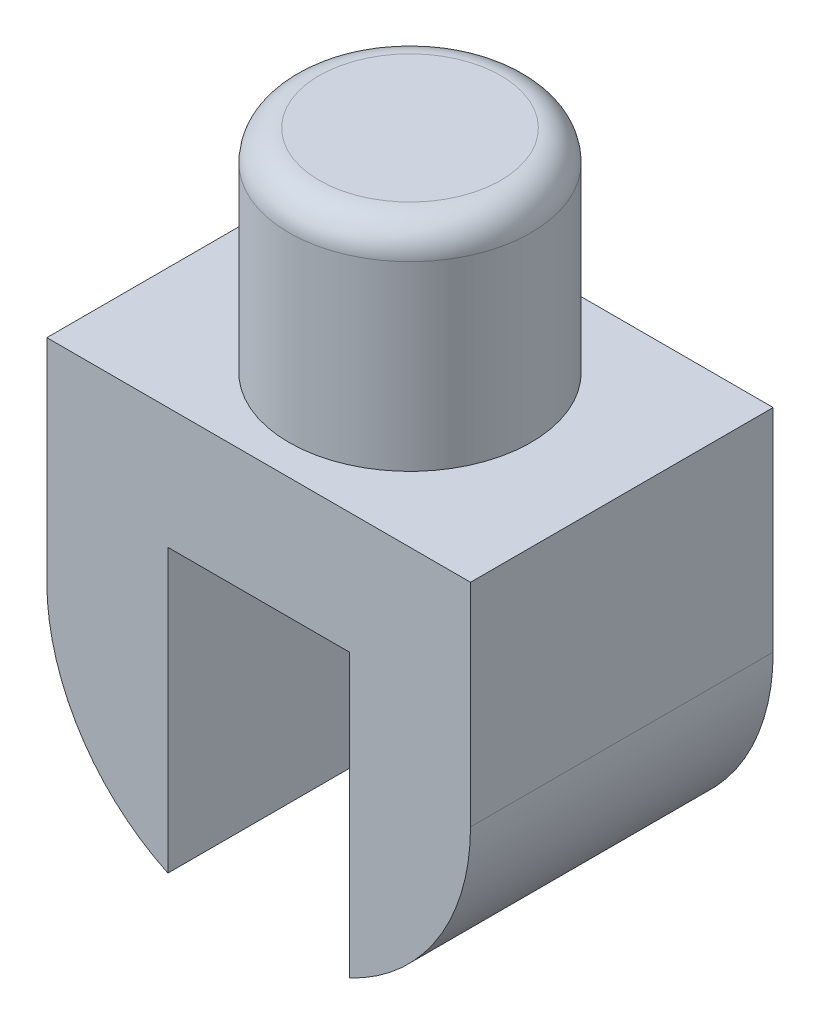
ISO-10303-21;
HEADER;
FILE_DESCRIPTION(('STEP AP214'),'2;1');
FILE_NAME('part.step','',(''),(''),'','','');
FILE_SCHEMA(('AUTOMOTIVE_DESIGN { 1 0 10303 214 1 1 1 1 }'));
ENDSEC;
DATA;
#1=APPLICATION_CONTEXT('core data for automotive mechanical design processes');
#2=APPLICATION_PROTOCOL_DEFINITION('international standard','automotive_design',2000,#1);
#3=PRODUCT_CONTEXT('',#1,'mechanical');
#4=PRODUCT('Part','Part','',(#3));
#5=PRODUCT_RELATED_PRODUCT_CATEGORY('part','',(#4));
#6=PRODUCT_DEFINITION_FORMATION('','',#4);
#7=PRODUCT_DEFINITION_CONTEXT('part definition',#1,'design');
#8=PRODUCT_DEFINITION('design','',#6,#7);
#9=PRODUCT_DEFINITION_SHAPE('','',#8);
#10=(LENGTH_UNIT() NAMED_UNIT(*) SI_UNIT(.MILLI.,.METRE.));
#11=(NAMED_UNIT(*) PLANE_ANGLE_UNIT() SI_UNIT($,.RADIAN.));
#12=(NAMED_UNIT(*) SI_UNIT($,.STERADIAN.) SOLID_ANGLE_UNIT());
#13=UNCERTAINTY_MEASURE_WITH_UNIT(LENGTH_MEASURE(1.E-05),#10,'distance_accuracy_value','');
#14=(GEOMETRIC_REPRESENTATION_CONTEXT(3) GLOBAL_UNCERTAINTY_ASSIGNED_CONTEXT((#13)) GLOBAL_UNIT_ASSIGNED_CONTEXT((#10,
#11,#12)) REPRESENTATION_CONTEXT('',''));
#15=CARTESIAN_POINT('',(0.,0.,0.));
#16=DIRECTION('',(0.,0.,1.));
#17=DIRECTION('',(1.,0.,0.));
#18=AXIS2_PLACEMENT_3D('',#15,#16,#17);
#19=CARTESIAN_POINT('',(0.,-1.94666007386461,-5.));
#20=DIRECTION('',(0.,0.,1.));
#21=DIRECTION('',(1.,0.,0.));
#22=AXIS2_PLACEMENT_3D('',#19,#20,#21);
#23=CYLINDRICAL_SURFACE('',#22,7.);
#24=CARTESIAN_POINT('',(0.,-1.94666007386461,-5.));
#25=DIRECTION('',(0.,0.,1.));
#26=DIRECTION('',(1.,0.,0.));
#27=AXIS2_PLACEMENT_3D('',#24,#25,#26);
#28=CIRCLE('',#27,7.);
#29=CARTESIAN_POINT('',(-7.,-1.94666007386461,-5.));
#30=VERTEX_POINT('',#29);
#31=CARTESIAN_POINT('',(-3.,-8.27121539420137,-5.));
#32=VERTEX_POINT('',#31);
#33=EDGE_CURVE('E143',#30,#32,#28,.T.);
#34=ORIENTED_EDGE('',*,*,#33,.T.);
#35=DIRECTION('',(0.,0.,1.));
#36=VECTOR('',#35,1.);
#37=CARTESIAN_POINT('',(-3.,-8.27121539420137,-5.));
#38=LINE('',#37,#36);
#39=CARTESIAN_POINT('',(-3.,-8.27121539420137,5.));
#40=VERTEX_POINT('',#39);
#41=EDGE_CURVE('E107',#32,#40,#38,.T.);
#42=ORIENTED_EDGE('',*,*,#41,.T.);
#43=CARTESIAN_POINT('',(0.,-1.94666007386461,5.));
#44=DIRECTION('',(0.,0.,1.));
#45=DIRECTION('',(1.,0.,0.));
#46=AXIS2_PLACEMENT_3D('',#43,#44,#45);
#47=CIRCLE('',#46,7.);
#48=CARTESIAN_POINT('',(-7.,-1.94666007386461,5.));
#49=VERTEX_POINT('',#48);
#50=EDGE_CURVE('E129',#49,#40,#47,.T.);
#51=ORIENTED_EDGE('',*,*,#50,.F.);
#52=DIRECTION('',(0.,0.,1.));
#53=VECTOR('',#52,1.);
#54=CARTESIAN_POINT('',(-7.,-1.94666007386461,-5.));
#55=LINE('',#54,#53);
#56=EDGE_CURVE('E58',#30,#49,#55,.T.);
#57=ORIENTED_EDGE('',*,*,#56,.F.);
#58=EDGE_LOOP('',(#34,#42,#51,#57));
#59=FACE_BOUND('',#58,.T.);
#60=ADVANCED_FACE('F35',(#59),#23,.T.);
#61=CARTESIAN_POINT('',(3.,-8.27121539420137,5.));
#62=VERTEX_POINT('',#61);
#63=CARTESIAN_POINT('',(7.,-1.94666007386461,5.));
#64=VERTEX_POINT('',#63);
#65=EDGE_CURVE('E133',#62,#64,#47,.T.);
#66=ORIENTED_EDGE('',*,*,#65,.F.);
#67=DIRECTION('',(0.,0.,1.));
#68=VECTOR('',#67,1.);
#69=CARTESIAN_POINT('',(3.,-8.27121539420137,-5.));
#70=LINE('',#69,#68);
#71=CARTESIAN_POINT('',(3.,-8.27121539420137,-5.));
#72=VERTEX_POINT('',#71);
#73=EDGE_CURVE('E121',#62,#72,#70,.F.);
#74=ORIENTED_EDGE('',*,*,#73,.T.);
#75=CARTESIAN_POINT('',(7.,-1.94666007386461,-5.));
#76=VERTEX_POINT('',#75);
#77=EDGE_CURVE('E142',#72,#76,#28,.T.);
#78=ORIENTED_EDGE('',*,*,#77,.T.);
#79=DIRECTION('',(0.,0.,1.));
#80=VECTOR('',#79,1.);
#81=CARTESIAN_POINT('',(7.,-1.94666007386461,-5.));
#82=LINE('',#81,#80);
#83=EDGE_CURVE('E154',#76,#64,#82,.T.);
#84=ORIENTED_EDGE('',*,*,#83,.T.);
#85=EDGE_LOOP('',(#66,#74,#78,#84));
#86=FACE_BOUND('',#85,.T.);
#87=ADVANCED_FACE('F183',(#86),#23,.T.);
#88=CARTESIAN_POINT('',(0.,-1.94666007386461,-5.));
#89=DIRECTION('',(0.,0.,1.));
#90=DIRECTION('',(1.,0.,0.));
#91=AXIS2_PLACEMENT_3D('',#88,#89,#90);
#92=PLANE('',#91);
#93=DIRECTION('',(0.,1.,0.));
#94=VECTOR('',#93,1.);
#95=CARTESIAN_POINT('',(-3.,-1.94666007386461,-5.));
#96=LINE('',#95,#94);
#97=CARTESIAN_POINT('',(-3.,1.05333992613539,-5.));
#98=VERTEX_POINT('',#97);
#99=EDGE_CURVE('E101',#32,#98,#96,.T.);
#100=ORIENTED_EDGE('',*,*,#99,.F.);
#101=ORIENTED_EDGE('',*,*,#33,.F.);
#102=DIRECTION('',(0.,-1.,0.));
#103=VECTOR('',#102,1.);
#104=CARTESIAN_POINT('',(-7.,-1.94666007386461,-5.));
#105=LINE('',#104,#103);
#106=CARTESIAN_POINT('',(-7.,5.05333992613539,-5.));
#107=VERTEX_POINT('',#106);
#108=EDGE_CURVE('E151',#107,#30,#105,.T.);
#109=ORIENTED_EDGE('',*,*,#108,.F.);
#110=DIRECTION('',(-1.,0.,0.));
#111=VECTOR('',#110,1.);
#112=CARTESIAN_POINT('',(-7.,5.05333992613539,-5.));
#113=LINE('',#112,#111);
#114=CARTESIAN_POINT('',(7.,5.05333992613539,-5.));
#115=VERTEX_POINT('',#114);
#116=EDGE_CURVE('E148',#115,#107,#113,.T.);
#117=ORIENTED_EDGE('',*,*,#116,.F.);
#118=DIRECTION('',(0.,1.,0.));
#119=VECTOR('',#118,1.);
#120=CARTESIAN_POINT('',(7.,-1.94666007386461,-5.));
#121=LINE('',#120,#119);
#122=EDGE_CURVE('E145',#76,#115,#121,.T.);
#123=ORIENTED_EDGE('',*,*,#122,.F.);
#124=ORIENTED_EDGE('',*,*,#77,.F.);
#125=DIRECTION('',(0.,-1.,0.));
#126=VECTOR('',#125,1.);
#127=CARTESIAN_POINT('',(3.,-1.94666007386461,-5.));
#128=LINE('',#127,#126);
#129=CARTESIAN_POINT('',(3.,1.05333992613539,-5.));
#130=VERTEX_POINT('',#129);
#131=EDGE_CURVE('E120',#130,#72,#128,.T.);
#132=ORIENTED_EDGE('',*,*,#131,.F.);
#133=DIRECTION('',(1.,0.,0.));
#134=VECTOR('',#133,1.);
#135=CARTESIAN_POINT('',(0.,1.05333992613539,-5.));
#136=LINE('',#135,#134);
#137=EDGE_CURVE('E113',#98,#130,#136,.T.);
#138=ORIENTED_EDGE('',*,*,#137,.F.);
#139=EDGE_LOOP('',(#100,#101,#109,#117,#123,#124,#132,#138));
#140=FACE_BOUND('',#139,.T.);
#141=ADVANCED_FACE('F118',(#140),#92,.F.);
#142=CARTESIAN_POINT('',(0.,-1.94666007386461,5.));
#143=DIRECTION('',(0.,0.,1.));
#144=DIRECTION('',(1.,0.,0.));
#145=AXIS2_PLACEMENT_3D('',#142,#143,#144);
#146=PLANE('',#145);
#147=ORIENTED_EDGE('',*,*,#50,.T.);
#148=DIRECTION('',(0.,1.,0.));
#149=VECTOR('',#148,1.);
#150=CARTESIAN_POINT('',(-3.,-1.94666007386461,5.));
#151=LINE('',#150,#149);
#152=CARTESIAN_POINT('',(-3.,1.05333992613539,5.));
#153=VERTEX_POINT('',#152);
#154=EDGE_CURVE('E168',#40,#153,#151,.T.);
#155=ORIENTED_EDGE('',*,*,#154,.T.);
#156=DIRECTION('',(1.,0.,0.));
#157=VECTOR('',#156,1.);
#158=CARTESIAN_POINT('',(0.,1.05333992613539,5.));
#159=LINE('',#158,#157);
#160=CARTESIAN_POINT('',(3.,1.05333992613539,5.));
#161=VERTEX_POINT('',#160);
#162=EDGE_CURVE('E115',#153,#161,#159,.T.);
#163=ORIENTED_EDGE('',*,*,#162,.T.);
#164=DIRECTION('',(0.,-1.,0.));
#165=VECTOR('',#164,1.);
#166=CARTESIAN_POINT('',(3.,-1.94666007386461,5.));
#167=LINE('',#166,#165);
#168=EDGE_CURVE('E165',#161,#62,#167,.T.);
#169=ORIENTED_EDGE('',*,*,#168,.T.);
#170=ORIENTED_EDGE('',*,*,#65,.T.);
#171=DIRECTION('',(0.,1.,0.));
#172=VECTOR('',#171,1.);
#173=CARTESIAN_POINT('',(7.,-1.94666007386461,5.));
#174=LINE('',#173,#172);
#175=CARTESIAN_POINT('',(7.,5.05333992613539,5.));
#176=VERTEX_POINT('',#175);
#177=EDGE_CURVE('E132',#64,#176,#174,.T.);
#178=ORIENTED_EDGE('',*,*,#177,.T.);
#179=DIRECTION('',(-1.,0.,0.));
#180=VECTOR('',#179,1.);
#181=CARTESIAN_POINT('',(-7.,5.05333992613539,5.));
#182=LINE('',#181,#180);
#183=CARTESIAN_POINT('',(-7.,5.05333992613539,5.));
#184=VERTEX_POINT('',#183);
#185=EDGE_CURVE('E136',#176,#184,#182,.T.);
#186=ORIENTED_EDGE('',*,*,#185,.T.);
#187=DIRECTION('',(0.,-1.,0.));
#188=VECTOR('',#187,1.);
#189=CARTESIAN_POINT('',(-7.,-1.94666007386461,5.));
#190=LINE('',#189,#188);
#191=EDGE_CURVE('E139',#184,#49,#190,.T.);
#192=ORIENTED_EDGE('',*,*,#191,.T.);
#193=EDGE_LOOP('',(#147,#155,#163,#169,#170,#178,#186,#192));
#194=FACE_BOUND('',#193,.T.);
#195=ADVANCED_FACE('F201',(#194),#146,.T.);
#196=CARTESIAN_POINT('',(-7.,-1.94666007386461,-5.));
#197=DIRECTION('',(-1.,0.,0.));
#198=DIRECTION('',(0.,0.,1.));
#199=AXIS2_PLACEMENT_3D('',#196,#197,#198);
#200=PLANE('',#199);
#201=ORIENTED_EDGE('',*,*,#56,.T.);
#202=ORIENTED_EDGE('',*,*,#191,.F.);
#203=DIRECTION('',(0.,0.,1.));
#204=VECTOR('',#203,1.);
#205=CARTESIAN_POINT('',(-7.,5.05333992613539,-5.));
#206=LINE('',#205,#204);
#207=EDGE_CURVE('E156',#107,#184,#206,.T.);
#208=ORIENTED_EDGE('',*,*,#207,.F.);
#209=ORIENTED_EDGE('',*,*,#108,.T.);
#210=EDGE_LOOP('',(#201,#202,#208,#209));
#211=FACE_BOUND('',#210,.T.);
#212=ADVANCED_FACE('F197',(#211),#200,.T.);
#213=CARTESIAN_POINT('',(-7.,5.05333992613539,-5.));
#214=DIRECTION('',(0.,1.,0.));
#215=DIRECTION('',(0.,0.,1.));
#216=AXIS2_PLACEMENT_3D('',#213,#214,#215);
#217=PLANE('',#216);
#218=CARTESIAN_POINT('',(0.,5.05333992613539,0.));
#219=DIRECTION('',(0.,1.,0.));
#220=DIRECTION('',(0.,0.,1.));
#221=AXIS2_PLACEMENT_3D('',#218,#219,#220);
#222=CIRCLE('',#221,4.);
#223=CARTESIAN_POINT('',(0.,5.05333992613539,4.));
#224=VERTEX_POINT('',#223);
#225=EDGE_CURVE('E110',#224,#224,#222,.F.);
#226=ORIENTED_EDGE('',*,*,#225,.T.);
#227=EDGE_LOOP('',(#226));
#228=FACE_BOUND('',#227,.T.);
#229=ORIENTED_EDGE('',*,*,#207,.T.);
#230=ORIENTED_EDGE('',*,*,#185,.F.);
#231=DIRECTION('',(0.,0.,1.));
#232=VECTOR('',#231,1.);
#233=CARTESIAN_POINT('',(7.,5.05333992613539,-5.));
#234=LINE('',#233,#232);
#235=EDGE_CURVE('E158',#115,#176,#234,.T.);
#236=ORIENTED_EDGE('',*,*,#235,.F.);
#237=ORIENTED_EDGE('',*,*,#116,.T.);
#238=EDGE_LOOP('',(#229,#230,#236,#237));
#239=FACE_BOUND('',#238,.T.);
#240=ADVANCED_FACE('F193',(#228,#239),#217,.T.);
#241=CARTESIAN_POINT('',(7.,-1.94666007386461,-5.));
#242=DIRECTION('',(1.,0.,0.));
#243=DIRECTION('',(0.,0.,-1.));
#244=AXIS2_PLACEMENT_3D('',#241,#242,#243);
#245=PLANE('',#244);
#246=ORIENTED_EDGE('',*,*,#235,.T.);
#247=ORIENTED_EDGE('',*,*,#177,.F.);
#248=ORIENTED_EDGE('',*,*,#83,.F.);
#249=ORIENTED_EDGE('',*,*,#122,.T.);
#250=EDGE_LOOP('',(#246,#247,#248,#249));
#251=FACE_BOUND('',#250,.T.);
#252=ADVANCED_FACE('F189',(#251),#245,.T.);
#253=CARTESIAN_POINT('',(0.,12.0533399261354,0.));
#254=DIRECTION('',(0.,-1.,0.));
#255=DIRECTION('',(0.,0.,-1.));
#256=AXIS2_PLACEMENT_3D('',#253,#254,#255);
#257=CYLINDRICAL_SURFACE('',#256,4.);
#258=CARTESIAN_POINT('',(0.,11.0533399261354,0.));
#259=DIRECTION('',(0.,1.,0.));
#260=DIRECTION('',(0.,0.,1.));
#261=AXIS2_PLACEMENT_3D('',#258,#259,#260);
#262=CIRCLE('',#261,4.);
#263=CARTESIAN_POINT('',(0.,11.0533399261354,4.));
#264=VERTEX_POINT('',#263);
#265=EDGE_CURVE('E11',#264,#264,#262,.F.);
#266=ORIENTED_EDGE('',*,*,#265,.T.);
#267=EDGE_LOOP('',(#266));
#268=FACE_BOUND('',#267,.T.);
#269=ORIENTED_EDGE('',*,*,#225,.F.);
#270=EDGE_LOOP('',(#269));
#271=FACE_BOUND('',#270,.T.);
#272=ADVANCED_FACE('F192',(#268,#271),#257,.T.);
#273=CARTESIAN_POINT('',(0.,12.0533399261354,0.));
#274=DIRECTION('',(0.,1.,0.));
#275=DIRECTION('',(0.,0.,1.));
#276=AXIS2_PLACEMENT_3D('',#273,#274,#275);
#277=PLANE('',#276);
#278=CARTESIAN_POINT('',(0.,12.0533399261354,0.));
#279=DIRECTION('',(0.,1.,0.));
#280=DIRECTION('',(0.,0.,1.));
#281=AXIS2_PLACEMENT_3D('',#278,#279,#280);
#282=CIRCLE('',#281,3.);
#283=CARTESIAN_POINT('',(0.,12.0533399261354,3.));
#284=VERTEX_POINT('',#283);
#285=EDGE_CURVE('E43',#284,#284,#282,.T.);
#286=ORIENTED_EDGE('',*,*,#285,.T.);
#287=EDGE_LOOP('',(#286));
#288=FACE_BOUND('',#287,.T.);
#289=ADVANCED_FACE('F172',(#288),#277,.T.);
#290=CARTESIAN_POINT('',(-3.,1.05333992613539,-6.));
#291=DIRECTION('',(1.,0.,0.));
#292=DIRECTION('',(0.,0.,-1.));
#293=AXIS2_PLACEMENT_3D('',#290,#291,#292);
#294=PLANE('',#293);
#295=ORIENTED_EDGE('',*,*,#99,.T.);
#296=DIRECTION('',(0.,0.,1.));
#297=VECTOR('',#296,1.);
#298=CARTESIAN_POINT('',(-3.,1.05333992613539,-6.));
#299=LINE('',#298,#297);
#300=EDGE_CURVE('E104',#98,#153,#299,.T.);
#301=ORIENTED_EDGE('',*,*,#300,.T.);
#302=ORIENTED_EDGE('',*,*,#154,.F.);
#303=ORIENTED_EDGE('',*,*,#41,.F.);
#304=EDGE_LOOP('',(#295,#301,#302,#303));
#305=FACE_BOUND('',#304,.T.);
#306=ADVANCED_FACE('F103',(#305),#294,.T.);
#307=CARTESIAN_POINT('',(3.,1.05333992613539,-6.));
#308=DIRECTION('',(-1.,0.,0.));
#309=DIRECTION('',(0.,0.,1.));
#310=AXIS2_PLACEMENT_3D('',#307,#308,#309);
#311=PLANE('',#310);
#312=ORIENTED_EDGE('',*,*,#131,.T.);
#313=ORIENTED_EDGE('',*,*,#73,.F.);
#314=ORIENTED_EDGE('',*,*,#168,.F.);
#315=DIRECTION('',(0.,0.,-1.));
#316=VECTOR('',#315,1.);
#317=CARTESIAN_POINT('',(3.,1.05333992613539,-6.));
#318=LINE('',#317,#316);
#319=EDGE_CURVE('E50',#161,#130,#318,.T.);
#320=ORIENTED_EDGE('',*,*,#319,.T.);
#321=EDGE_LOOP('',(#312,#313,#314,#320));
#322=FACE_BOUND('',#321,.T.);
#323=ADVANCED_FACE('F179',(#322),#311,.T.);
#324=CARTESIAN_POINT('',(0.,1.05333992613539,0.));
#325=DIRECTION('',(0.,-1.,0.));
#326=DIRECTION('',(0.,0.,-1.));
#327=AXIS2_PLACEMENT_3D('',#324,#325,#326);
#328=PLANE('',#327);
#329=ORIENTED_EDGE('',*,*,#137,.T.);
#330=ORIENTED_EDGE('',*,*,#319,.F.);
#331=ORIENTED_EDGE('',*,*,#162,.F.);
#332=ORIENTED_EDGE('',*,*,#300,.F.);
#333=EDGE_LOOP('',(#329,#330,#331,#332));
#334=FACE_BOUND('',#333,.T.);
#335=ADVANCED_FACE('F112',(#334),#328,.T.);
#336=CARTESIAN_POINT('',(0.,11.0533399261354,0.));
#337=DIRECTION('',(0.,1.,0.));
#338=DIRECTION('',(0.,0.,1.));
#339=AXIS2_PLACEMENT_3D('',#336,#337,#338);
#340=TOROIDAL_SURFACE('',#339,3.,1.);
#341=ORIENTED_EDGE('',*,*,#265,.F.);
#342=EDGE_LOOP('',(#341));
#343=FACE_BOUND('',#342,.T.);
#344=ORIENTED_EDGE('',*,*,#285,.F.);
#345=EDGE_LOOP('',(#344));
#346=FACE_BOUND('',#345,.T.);
#347=ADVANCED_FACE('F37',(#343,#346),#340,.T.);
#348=CLOSED_SHELL('',(#60,#87,#141,#195,#212,#240,#252,#272,#289,#306,#323,#335,#347));
#349=MANIFOLD_SOLID_BREP('B2',#348);
#350=ADVANCED_BREP_SHAPE_REPRESENTATION('',(#18,#349),#14);
#351=SHAPE_DEFINITION_REPRESENTATION(#9,#350);
ENDSEC;
END-ISO-10303-21;
